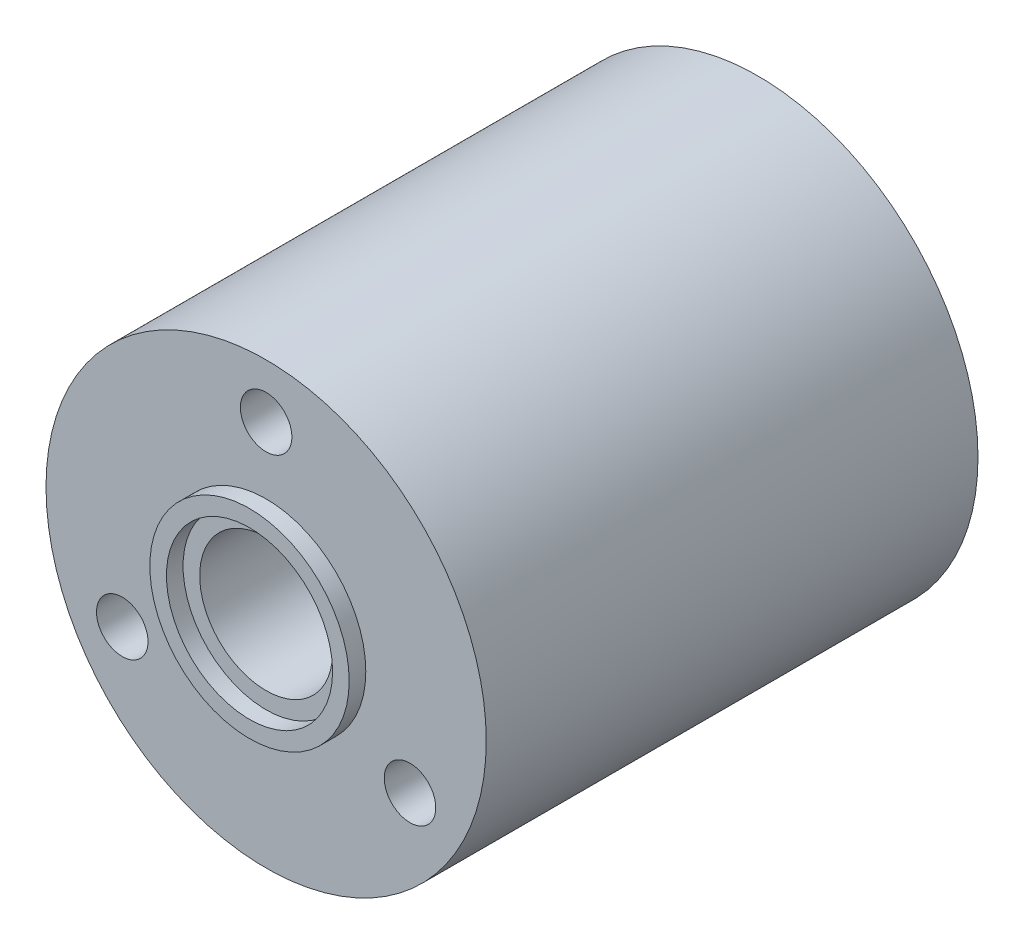
ISO-10303-21;
HEADER;
FILE_DESCRIPTION(('STEP AP214'),'2;1');
FILE_NAME('part.step','',(''),(''),'','','');
FILE_SCHEMA(('AUTOMOTIVE_DESIGN { 1 0 10303 214 1 1 1 1 }'));
ENDSEC;
DATA;
#1=APPLICATION_CONTEXT('core data for automotive mechanical design processes');
#2=APPLICATION_PROTOCOL_DEFINITION('international standard','automotive_design',2000,#1);
#3=PRODUCT_CONTEXT('',#1,'mechanical');
#4=PRODUCT('Part','Part','',(#3));
#5=PRODUCT_RELATED_PRODUCT_CATEGORY('part','',(#4));
#6=PRODUCT_DEFINITION_FORMATION('','',#4);
#7=PRODUCT_DEFINITION_CONTEXT('part definition',#1,'design');
#8=PRODUCT_DEFINITION('design','',#6,#7);
#9=PRODUCT_DEFINITION_SHAPE('','',#8);
#10=(LENGTH_UNIT() NAMED_UNIT(*) SI_UNIT(.MILLI.,.METRE.));
#11=(NAMED_UNIT(*) PLANE_ANGLE_UNIT() SI_UNIT($,.RADIAN.));
#12=(NAMED_UNIT(*) SI_UNIT($,.STERADIAN.) SOLID_ANGLE_UNIT());
#13=UNCERTAINTY_MEASURE_WITH_UNIT(LENGTH_MEASURE(1.E-05),#10,'distance_accuracy_value','');
#14=(GEOMETRIC_REPRESENTATION_CONTEXT(3) GLOBAL_UNCERTAINTY_ASSIGNED_CONTEXT((#13)) GLOBAL_UNIT_ASSIGNED_CONTEXT((#10,
#11,#12)) REPRESENTATION_CONTEXT('',''));
#15=CARTESIAN_POINT('',(0.,0.,0.));
#16=DIRECTION('',(0.,0.,1.));
#17=DIRECTION('',(1.,0.,0.));
#18=AXIS2_PLACEMENT_3D('',#15,#16,#17);
#19=CARTESIAN_POINT('',(0.,0.,14.8));
#20=DIRECTION('',(0.,0.,-1.));
#21=DIRECTION('',(-1.,0.,0.));
#22=AXIS2_PLACEMENT_3D('',#19,#20,#21);
#23=CYLINDRICAL_SURFACE('',#22,13.25);
#24=CARTESIAN_POINT('',(0.,0.,14.8));
#25=DIRECTION('',(0.,0.,1.));
#26=DIRECTION('',(1.,0.,0.));
#27=AXIS2_PLACEMENT_3D('',#24,#25,#26);
#28=CIRCLE('',#27,13.25);
#29=CARTESIAN_POINT('',(13.25,0.,14.8));
#30=VERTEX_POINT('',#29);
#31=EDGE_CURVE('E92',#30,#30,#28,.T.);
#32=ORIENTED_EDGE('',*,*,#31,.F.);
#33=EDGE_LOOP('',(#32));
#34=FACE_BOUND('',#33,.T.);
#35=CARTESIAN_POINT('',(0.,0.,-14.8));
#36=DIRECTION('',(0.,0.,1.));
#37=DIRECTION('',(1.,0.,0.));
#38=AXIS2_PLACEMENT_3D('',#35,#36,#37);
#39=CIRCLE('',#38,13.25);
#40=CARTESIAN_POINT('',(13.25,0.,-14.8));
#41=VERTEX_POINT('',#40);
#42=EDGE_CURVE('E114',#41,#41,#39,.T.);
#43=ORIENTED_EDGE('',*,*,#42,.T.);
#44=EDGE_LOOP('',(#43));
#45=FACE_BOUND('',#44,.T.);
#46=ADVANCED_FACE('F60',(#34,#45),#23,.T.);
#47=CARTESIAN_POINT('',(0.,10.,14.8));
#48=DIRECTION('',(0.,0.,-1.));
#49=DIRECTION('',(-1.,0.,0.));
#50=AXIS2_PLACEMENT_3D('',#47,#48,#49);
#51=CYLINDRICAL_SURFACE('',#50,1.55);
#52=CARTESIAN_POINT('',(0.,10.,14.8));
#53=DIRECTION('',(0.,0.,1.));
#54=DIRECTION('',(1.,0.,0.));
#55=AXIS2_PLACEMENT_3D('',#52,#53,#54);
#56=CIRCLE('',#55,1.55);
#57=CARTESIAN_POINT('',(1.55,10.,14.8));
#58=VERTEX_POINT('',#57);
#59=EDGE_CURVE('E93',#58,#58,#56,.T.);
#60=ORIENTED_EDGE('',*,*,#59,.T.);
#61=EDGE_LOOP('',(#60));
#62=FACE_BOUND('',#61,.T.);
#63=CARTESIAN_POINT('',(0.,10.,-14.8));
#64=DIRECTION('',(0.,0.,1.));
#65=DIRECTION('',(1.,0.,0.));
#66=AXIS2_PLACEMENT_3D('',#63,#64,#65);
#67=CIRCLE('',#66,1.55);
#68=CARTESIAN_POINT('',(1.55,10.,-14.8));
#69=VERTEX_POINT('',#68);
#70=EDGE_CURVE('E108',#69,#69,#67,.T.);
#71=ORIENTED_EDGE('',*,*,#70,.F.);
#72=EDGE_LOOP('',(#71));
#73=FACE_BOUND('',#72,.T.);
#74=ADVANCED_FACE('F157',(#62,#73),#51,.F.);
#75=CARTESIAN_POINT('',(8.66025403784437,-5.00000000000004,14.8));
#76=DIRECTION('',(0.,0.,-1.));
#77=DIRECTION('',(-1.,0.,0.));
#78=AXIS2_PLACEMENT_3D('',#75,#76,#77);
#79=CYLINDRICAL_SURFACE('',#78,1.55);
#80=CARTESIAN_POINT('',(8.66025403784437,-5.00000000000004,14.8));
#81=DIRECTION('',(0.,0.,1.));
#82=DIRECTION('',(1.,0.,0.));
#83=AXIS2_PLACEMENT_3D('',#80,#81,#82);
#84=CIRCLE('',#83,1.55);
#85=CARTESIAN_POINT('',(10.2102540378444,-5.00000000000004,14.8));
#86=VERTEX_POINT('',#85);
#87=EDGE_CURVE('E88',#86,#86,#84,.T.);
#88=ORIENTED_EDGE('',*,*,#87,.T.);
#89=EDGE_LOOP('',(#88));
#90=FACE_BOUND('',#89,.T.);
#91=CARTESIAN_POINT('',(8.66025403784437,-5.00000000000004,-14.8));
#92=DIRECTION('',(0.,0.,1.));
#93=DIRECTION('',(1.,0.,0.));
#94=AXIS2_PLACEMENT_3D('',#91,#92,#93);
#95=CIRCLE('',#94,1.55);
#96=CARTESIAN_POINT('',(10.2102540378444,-5.00000000000004,-14.8));
#97=VERTEX_POINT('',#96);
#98=EDGE_CURVE('E104',#97,#97,#95,.T.);
#99=ORIENTED_EDGE('',*,*,#98,.F.);
#100=EDGE_LOOP('',(#99));
#101=FACE_BOUND('',#100,.T.);
#102=ADVANCED_FACE('F164',(#90,#101),#79,.F.);
#103=CARTESIAN_POINT('',(-8.66025403784443,-4.99999999999992,14.8));
#104=DIRECTION('',(0.,0.,-1.));
#105=DIRECTION('',(-1.,0.,0.));
#106=AXIS2_PLACEMENT_3D('',#103,#104,#105);
#107=CYLINDRICAL_SURFACE('',#106,1.55);
#108=CARTESIAN_POINT('',(-8.66025403784443,-4.99999999999992,14.8));
#109=DIRECTION('',(0.,0.,1.));
#110=DIRECTION('',(1.,0.,0.));
#111=AXIS2_PLACEMENT_3D('',#108,#109,#110);
#112=CIRCLE('',#111,1.55);
#113=CARTESIAN_POINT('',(-7.11025403784443,-4.99999999999992,14.8));
#114=VERTEX_POINT('',#113);
#115=EDGE_CURVE('E82',#114,#114,#112,.T.);
#116=ORIENTED_EDGE('',*,*,#115,.T.);
#117=EDGE_LOOP('',(#116));
#118=FACE_BOUND('',#117,.T.);
#119=CARTESIAN_POINT('',(-8.66025403784443,-4.99999999999992,-14.8));
#120=DIRECTION('',(0.,0.,1.));
#121=DIRECTION('',(1.,0.,0.));
#122=AXIS2_PLACEMENT_3D('',#119,#120,#121);
#123=CIRCLE('',#122,1.55);
#124=CARTESIAN_POINT('',(-7.11025403784443,-4.99999999999992,-14.8));
#125=VERTEX_POINT('',#124);
#126=EDGE_CURVE('E77',#125,#125,#123,.T.);
#127=ORIENTED_EDGE('',*,*,#126,.F.);
#128=EDGE_LOOP('',(#127));
#129=FACE_BOUND('',#128,.T.);
#130=ADVANCED_FACE('F56',(#118,#129),#107,.F.);
#131=CARTESIAN_POINT('',(0.,0.,14.8));
#132=DIRECTION('',(0.,0.,1.));
#133=DIRECTION('',(1.,0.,0.));
#134=AXIS2_PLACEMENT_3D('',#131,#132,#133);
#135=PLANE('',#134);
#136=CARTESIAN_POINT('',(0.,0.,14.8));
#137=DIRECTION('',(0.,0.,1.));
#138=DIRECTION('',(1.,0.,0.));
#139=AXIS2_PLACEMENT_3D('',#136,#137,#138);
#140=CIRCLE('',#139,6.);
#141=CARTESIAN_POINT('',(6.,0.,14.8));
#142=VERTEX_POINT('',#141);
#143=EDGE_CURVE('E79',#142,#142,#140,.F.);
#144=ORIENTED_EDGE('',*,*,#143,.T.);
#145=EDGE_LOOP('',(#144));
#146=FACE_BOUND('',#145,.T.);
#147=ORIENTED_EDGE('',*,*,#115,.F.);
#148=EDGE_LOOP('',(#147));
#149=FACE_BOUND('',#148,.T.);
#150=ORIENTED_EDGE('',*,*,#87,.F.);
#151=EDGE_LOOP('',(#150));
#152=FACE_BOUND('',#151,.T.);
#153=ORIENTED_EDGE('',*,*,#59,.F.);
#154=EDGE_LOOP('',(#153));
#155=FACE_BOUND('',#154,.T.);
#156=ORIENTED_EDGE('',*,*,#31,.T.);
#157=EDGE_LOOP('',(#156));
#158=FACE_BOUND('',#157,.T.);
#159=ADVANCED_FACE('F179',(#146,#149,#152,#155,#158),#135,.T.);
#160=CARTESIAN_POINT('',(0.,0.,-14.8));
#161=DIRECTION('',(0.,0.,1.));
#162=DIRECTION('',(1.,0.,0.));
#163=AXIS2_PLACEMENT_3D('',#160,#161,#162);
#164=PLANE('',#163);
#165=CARTESIAN_POINT('',(0.,0.,-14.8));
#166=DIRECTION('',(0.,0.,1.));
#167=DIRECTION('',(1.,0.,0.));
#168=AXIS2_PLACEMENT_3D('',#165,#166,#167);
#169=CIRCLE('',#168,6.);
#170=CARTESIAN_POINT('',(6.,0.,-14.8));
#171=VERTEX_POINT('',#170);
#172=EDGE_CURVE('E64',#171,#171,#169,.F.);
#173=ORIENTED_EDGE('',*,*,#172,.F.);
#174=EDGE_LOOP('',(#173));
#175=FACE_BOUND('',#174,.T.);
#176=ORIENTED_EDGE('',*,*,#126,.T.);
#177=EDGE_LOOP('',(#176));
#178=FACE_BOUND('',#177,.T.);
#179=ORIENTED_EDGE('',*,*,#98,.T.);
#180=EDGE_LOOP('',(#179));
#181=FACE_BOUND('',#180,.T.);
#182=ORIENTED_EDGE('',*,*,#70,.T.);
#183=EDGE_LOOP('',(#182));
#184=FACE_BOUND('',#183,.T.);
#185=ORIENTED_EDGE('',*,*,#42,.F.);
#186=EDGE_LOOP('',(#185));
#187=FACE_BOUND('',#186,.T.);
#188=ADVANCED_FACE('F184',(#175,#178,#181,#184,#187),#164,.F.);
#189=CARTESIAN_POINT('',(0.,0.,15.8));
#190=DIRECTION('',(0.,0.,-1.));
#191=DIRECTION('',(-1.,0.,0.));
#192=AXIS2_PLACEMENT_3D('',#189,#190,#191);
#193=CYLINDRICAL_SURFACE('',#192,6.);
#194=CARTESIAN_POINT('',(0.,0.,-15.8));
#195=DIRECTION('',(0.,0.,1.));
#196=DIRECTION('',(1.,0.,0.));
#197=AXIS2_PLACEMENT_3D('',#194,#195,#196);
#198=CIRCLE('',#197,6.);
#199=CARTESIAN_POINT('',(6.,0.,-15.8));
#200=VERTEX_POINT('',#199);
#201=EDGE_CURVE('E74',#200,#200,#198,.T.);
#202=ORIENTED_EDGE('',*,*,#201,.T.);
#203=EDGE_LOOP('',(#202));
#204=FACE_BOUND('',#203,.T.);
#205=ORIENTED_EDGE('',*,*,#172,.T.);
#206=EDGE_LOOP('',(#205));
#207=FACE_BOUND('',#206,.T.);
#208=ADVANCED_FACE('F153',(#204,#207),#193,.T.);
#209=CARTESIAN_POINT('',(0.,0.,-15.8));
#210=DIRECTION('',(0.,0.,1.));
#211=DIRECTION('',(1.,0.,0.));
#212=AXIS2_PLACEMENT_3D('',#209,#210,#211);
#213=PLANE('',#212);
#214=ORIENTED_EDGE('',*,*,#201,.F.);
#215=EDGE_LOOP('',(#214));
#216=FACE_BOUND('',#215,.T.);
#217=CARTESIAN_POINT('',(0.,0.,-15.8));
#218=DIRECTION('',(0.,0.,1.));
#219=DIRECTION('',(1.,0.,0.));
#220=AXIS2_PLACEMENT_3D('',#217,#218,#219);
#221=CIRCLE('',#220,5.);
#222=CARTESIAN_POINT('',(5.,0.,-15.8));
#223=VERTEX_POINT('',#222);
#224=EDGE_CURVE('E131',#223,#223,#221,.T.);
#225=ORIENTED_EDGE('',*,*,#224,.T.);
#226=EDGE_LOOP('',(#225));
#227=FACE_BOUND('',#226,.T.);
#228=ADVANCED_FACE('F152',(#216,#227),#213,.F.);
#229=CARTESIAN_POINT('',(0.,0.,15.8));
#230=DIRECTION('',(0.,0.,-1.));
#231=DIRECTION('',(-1.,0.,0.));
#232=AXIS2_PLACEMENT_3D('',#229,#230,#231);
#233=CYLINDRICAL_SURFACE('',#232,5.);
#234=ORIENTED_EDGE('',*,*,#224,.F.);
#235=EDGE_LOOP('',(#234));
#236=FACE_BOUND('',#235,.T.);
#237=CARTESIAN_POINT('',(0.,0.,-14.8));
#238=DIRECTION('',(0.,0.,1.));
#239=DIRECTION('',(1.,0.,0.));
#240=AXIS2_PLACEMENT_3D('',#237,#238,#239);
#241=CIRCLE('',#240,5.);
#242=CARTESIAN_POINT('',(5.,0.,-14.8));
#243=VERTEX_POINT('',#242);
#244=EDGE_CURVE('E81',#243,#243,#241,.F.);
#245=ORIENTED_EDGE('',*,*,#244,.F.);
#246=EDGE_LOOP('',(#245));
#247=FACE_BOUND('',#246,.T.);
#248=ADVANCED_FACE('F144',(#236,#247),#233,.F.);
#249=CARTESIAN_POINT('',(0.,0.,15.8));
#250=DIRECTION('',(0.,0.,1.));
#251=DIRECTION('',(1.,0.,0.));
#252=AXIS2_PLACEMENT_3D('',#249,#250,#251);
#253=PLANE('',#252);
#254=CARTESIAN_POINT('',(0.,0.,15.8));
#255=DIRECTION('',(0.,0.,1.));
#256=DIRECTION('',(1.,0.,0.));
#257=AXIS2_PLACEMENT_3D('',#254,#255,#256);
#258=CIRCLE('',#257,6.);
#259=CARTESIAN_POINT('',(6.,0.,15.8));
#260=VERTEX_POINT('',#259);
#261=EDGE_CURVE('E121',#260,#260,#258,.T.);
#262=ORIENTED_EDGE('',*,*,#261,.T.);
#263=EDGE_LOOP('',(#262));
#264=FACE_BOUND('',#263,.T.);
#265=CARTESIAN_POINT('',(0.,0.,15.8));
#266=DIRECTION('',(0.,0.,1.));
#267=DIRECTION('',(1.,0.,0.));
#268=AXIS2_PLACEMENT_3D('',#265,#266,#267);
#269=CIRCLE('',#268,5.);
#270=CARTESIAN_POINT('',(5.,0.,15.8));
#271=VERTEX_POINT('',#270);
#272=EDGE_CURVE('E128',#271,#271,#269,.T.);
#273=ORIENTED_EDGE('',*,*,#272,.F.);
#274=EDGE_LOOP('',(#273));
#275=FACE_BOUND('',#274,.T.);
#276=ADVANCED_FACE('F142',(#264,#275),#253,.T.);
#277=ORIENTED_EDGE('',*,*,#143,.F.);
#278=EDGE_LOOP('',(#277));
#279=FACE_BOUND('',#278,.T.);
#280=ORIENTED_EDGE('',*,*,#261,.F.);
#281=EDGE_LOOP('',(#280));
#282=FACE_BOUND('',#281,.T.);
#283=ADVANCED_FACE('F145',(#279,#282),#193,.T.);
#284=CARTESIAN_POINT('',(0.,0.,14.8));
#285=DIRECTION('',(0.,0.,1.));
#286=DIRECTION('',(1.,0.,0.));
#287=AXIS2_PLACEMENT_3D('',#284,#285,#286);
#288=CIRCLE('',#287,5.);
#289=CARTESIAN_POINT('',(5.,0.,14.8));
#290=VERTEX_POINT('',#289);
#291=EDGE_CURVE('E11',#290,#290,#288,.F.);
#292=ORIENTED_EDGE('',*,*,#291,.T.);
#293=EDGE_LOOP('',(#292));
#294=FACE_BOUND('',#293,.T.);
#295=ORIENTED_EDGE('',*,*,#272,.T.);
#296=EDGE_LOOP('',(#295));
#297=FACE_BOUND('',#296,.T.);
#298=ADVANCED_FACE('F140',(#294,#297),#233,.F.);
#299=CARTESIAN_POINT('',(0.,0.,14.8));
#300=DIRECTION('',(0.,0.,1.));
#301=DIRECTION('',(1.,0.,0.));
#302=AXIS2_PLACEMENT_3D('',#299,#300,#301);
#303=CIRCLE('',#302,4.);
#304=CARTESIAN_POINT('',(4.,0.,14.8));
#305=VERTEX_POINT('',#304);
#306=EDGE_CURVE('E72',#305,#305,#303,.T.);
#307=ORIENTED_EDGE('',*,*,#306,.F.);
#308=EDGE_LOOP('',(#307));
#309=FACE_BOUND('',#308,.T.);
#310=ORIENTED_EDGE('',*,*,#291,.F.);
#311=EDGE_LOOP('',(#310));
#312=FACE_BOUND('',#311,.T.);
#313=ADVANCED_FACE('F203',(#309,#312),#135,.T.);
#314=CARTESIAN_POINT('',(0.,0.,14.8));
#315=DIRECTION('',(0.,0.,-1.));
#316=DIRECTION('',(-1.,0.,0.));
#317=AXIS2_PLACEMENT_3D('',#314,#315,#316);
#318=CYLINDRICAL_SURFACE('',#317,4.);
#319=ORIENTED_EDGE('',*,*,#306,.T.);
#320=EDGE_LOOP('',(#319));
#321=FACE_BOUND('',#320,.T.);
#322=CARTESIAN_POINT('',(0.,0.,-14.8));
#323=DIRECTION('',(0.,0.,1.));
#324=DIRECTION('',(1.,0.,0.));
#325=AXIS2_PLACEMENT_3D('',#322,#323,#324);
#326=CIRCLE('',#325,4.);
#327=CARTESIAN_POINT('',(4.,0.,-14.8));
#328=VERTEX_POINT('',#327);
#329=EDGE_CURVE('E87',#328,#328,#326,.T.);
#330=ORIENTED_EDGE('',*,*,#329,.F.);
#331=EDGE_LOOP('',(#330));
#332=FACE_BOUND('',#331,.T.);
#333=ADVANCED_FACE('F174',(#321,#332),#318,.F.);
#334=ORIENTED_EDGE('',*,*,#329,.T.);
#335=EDGE_LOOP('',(#334));
#336=FACE_BOUND('',#335,.T.);
#337=ORIENTED_EDGE('',*,*,#244,.T.);
#338=EDGE_LOOP('',(#337));
#339=FACE_BOUND('',#338,.T.);
#340=ADVANCED_FACE('F190',(#336,#339),#164,.F.);
#341=CLOSED_SHELL('',(#46,#74,#102,#130,#159,#188,#208,#228,#248,#276,#283,#298,#313,#333,#340));
#342=MANIFOLD_SOLID_BREP('B2',#341);
#343=ADVANCED_BREP_SHAPE_REPRESENTATION('',(#18,#342),#14);
#344=SHAPE_DEFINITION_REPRESENTATION(#9,#343);
ENDSEC;
END-ISO-10303-21;
